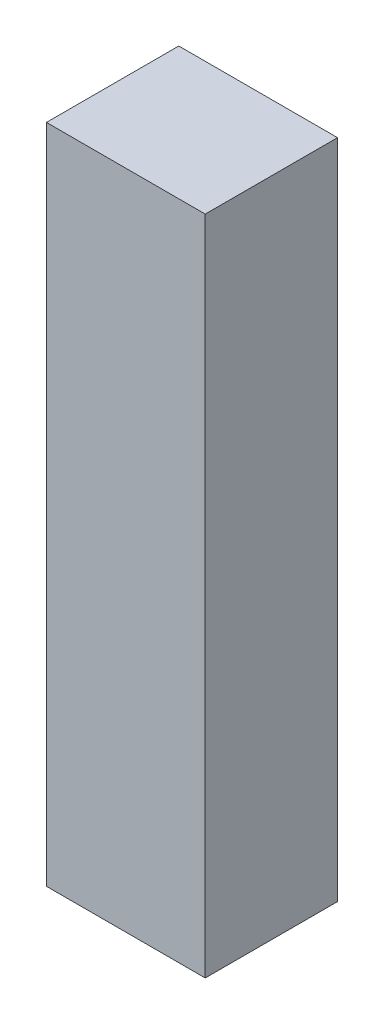
ISO-10303-21;
HEADER;
FILE_DESCRIPTION(('STEP AP214'),'2;1');
FILE_NAME('part.step','',(''),(''),'','','');
FILE_SCHEMA(('AUTOMOTIVE_DESIGN { 1 0 10303 214 1 1 1 1 }'));
ENDSEC;
DATA;
#1=APPLICATION_CONTEXT('core data for automotive mechanical design processes');
#2=APPLICATION_PROTOCOL_DEFINITION('international standard','automotive_design',2000,#1);
#3=PRODUCT_CONTEXT('',#1,'mechanical');
#4=PRODUCT('Part','Part','',(#3));
#5=PRODUCT_RELATED_PRODUCT_CATEGORY('part','',(#4));
#6=PRODUCT_DEFINITION_FORMATION('','',#4);
#7=PRODUCT_DEFINITION_CONTEXT('part definition',#1,'design');
#8=PRODUCT_DEFINITION('design','',#6,#7);
#9=PRODUCT_DEFINITION_SHAPE('','',#8);
#10=(LENGTH_UNIT() NAMED_UNIT(*) SI_UNIT(.MILLI.,.METRE.));
#11=(NAMED_UNIT(*) PLANE_ANGLE_UNIT() SI_UNIT($,.RADIAN.));
#12=(NAMED_UNIT(*) SI_UNIT($,.STERADIAN.) SOLID_ANGLE_UNIT());
#13=UNCERTAINTY_MEASURE_WITH_UNIT(LENGTH_MEASURE(1.E-05),#10,'distance_accuracy_value','');
#14=(GEOMETRIC_REPRESENTATION_CONTEXT(3) GLOBAL_UNCERTAINTY_ASSIGNED_CONTEXT((#13)) GLOBAL_UNIT_ASSIGNED_CONTEXT((#10,
#11,#12)) REPRESENTATION_CONTEXT('',''));
#15=CARTESIAN_POINT('',(0.,0.,0.));
#16=DIRECTION('',(0.,0.,1.));
#17=DIRECTION('',(1.,0.,0.));
#18=AXIS2_PLACEMENT_3D('',#15,#16,#17);
#19=CARTESIAN_POINT('',(12.,50.,20.));
#20=DIRECTION('',(-1.,0.,0.));
#21=DIRECTION('',(0.,0.,1.));
#22=AXIS2_PLACEMENT_3D('',#19,#20,#21);
#23=PLANE('',#22);
#24=DIRECTION('',(0.,1.,0.));
#25=VECTOR('',#24,1.);
#26=CARTESIAN_POINT('',(12.,50.,0.));
#27=LINE('',#26,#25);
#28=CARTESIAN_POINT('',(12.,-50.,0.));
#29=VERTEX_POINT('',#28);
#30=CARTESIAN_POINT('',(12.,50.,0.));
#31=VERTEX_POINT('',#30);
#32=EDGE_CURVE('E97',#29,#31,#27,.T.);
#33=ORIENTED_EDGE('',*,*,#32,.T.);
#34=DIRECTION('',(0.,0.,-1.));
#35=VECTOR('',#34,1.);
#36=CARTESIAN_POINT('',(12.,50.,20.));
#37=LINE('',#36,#35);
#38=CARTESIAN_POINT('',(12.,50.,20.));
#39=VERTEX_POINT('',#38);
#40=EDGE_CURVE('E11',#39,#31,#37,.T.);
#41=ORIENTED_EDGE('',*,*,#40,.F.);
#42=DIRECTION('',(0.,1.,0.));
#43=VECTOR('',#42,1.);
#44=CARTESIAN_POINT('',(12.,50.,20.));
#45=LINE('',#44,#43);
#46=CARTESIAN_POINT('',(12.,-50.,20.));
#47=VERTEX_POINT('',#46);
#48=EDGE_CURVE('E85',#47,#39,#45,.T.);
#49=ORIENTED_EDGE('',*,*,#48,.F.);
#50=DIRECTION('',(0.,0.,-1.));
#51=VECTOR('',#50,1.);
#52=CARTESIAN_POINT('',(12.,-50.,20.));
#53=LINE('',#52,#51);
#54=EDGE_CURVE('E93',#47,#29,#53,.T.);
#55=ORIENTED_EDGE('',*,*,#54,.T.);
#56=EDGE_LOOP('',(#33,#41,#49,#55));
#57=FACE_BOUND('',#56,.T.);
#58=ADVANCED_FACE('F34',(#57),#23,.F.);
#59=CARTESIAN_POINT('',(-12.,50.,20.));
#60=DIRECTION('',(0.,-1.,0.));
#61=DIRECTION('',(0.,0.,-1.));
#62=AXIS2_PLACEMENT_3D('',#59,#60,#61);
#63=PLANE('',#62);
#64=DIRECTION('',(-1.,0.,0.));
#65=VECTOR('',#64,1.);
#66=CARTESIAN_POINT('',(-12.,50.,0.));
#67=LINE('',#66,#65);
#68=CARTESIAN_POINT('',(-12.,50.,0.));
#69=VERTEX_POINT('',#68);
#70=EDGE_CURVE('E89',#31,#69,#67,.T.);
#71=ORIENTED_EDGE('',*,*,#70,.T.);
#72=DIRECTION('',(0.,0.,-1.));
#73=VECTOR('',#72,1.);
#74=CARTESIAN_POINT('',(-12.,50.,20.));
#75=LINE('',#74,#73);
#76=CARTESIAN_POINT('',(-12.,50.,20.));
#77=VERTEX_POINT('',#76);
#78=EDGE_CURVE('E42',#77,#69,#75,.T.);
#79=ORIENTED_EDGE('',*,*,#78,.F.);
#80=DIRECTION('',(-1.,0.,0.));
#81=VECTOR('',#80,1.);
#82=CARTESIAN_POINT('',(-12.,50.,20.));
#83=LINE('',#82,#81);
#84=EDGE_CURVE('E80',#39,#77,#83,.T.);
#85=ORIENTED_EDGE('',*,*,#84,.F.);
#86=ORIENTED_EDGE('',*,*,#40,.T.);
#87=EDGE_LOOP('',(#71,#79,#85,#86));
#88=FACE_BOUND('',#87,.T.);
#89=ADVANCED_FACE('F88',(#88),#63,.F.);
#90=CARTESIAN_POINT('',(-12.,50.,20.));
#91=DIRECTION('',(1.,0.,0.));
#92=DIRECTION('',(0.,0.,-1.));
#93=AXIS2_PLACEMENT_3D('',#90,#91,#92);
#94=PLANE('',#93);
#95=DIRECTION('',(0.,-1.,0.));
#96=VECTOR('',#95,1.);
#97=CARTESIAN_POINT('',(-12.,50.,0.));
#98=LINE('',#97,#96);
#99=CARTESIAN_POINT('',(-12.,-50.,0.));
#100=VERTEX_POINT('',#99);
#101=EDGE_CURVE('E67',#69,#100,#98,.T.);
#102=ORIENTED_EDGE('',*,*,#101,.T.);
#103=DIRECTION('',(0.,0.,-1.));
#104=VECTOR('',#103,1.);
#105=CARTESIAN_POINT('',(-12.,-50.,20.));
#106=LINE('',#105,#104);
#107=CARTESIAN_POINT('',(-12.,-50.,20.));
#108=VERTEX_POINT('',#107);
#109=EDGE_CURVE('E90',#108,#100,#106,.T.);
#110=ORIENTED_EDGE('',*,*,#109,.F.);
#111=DIRECTION('',(0.,-1.,0.));
#112=VECTOR('',#111,1.);
#113=CARTESIAN_POINT('',(-12.,50.,20.));
#114=LINE('',#113,#112);
#115=EDGE_CURVE('E83',#77,#108,#114,.T.);
#116=ORIENTED_EDGE('',*,*,#115,.F.);
#117=ORIENTED_EDGE('',*,*,#78,.T.);
#118=EDGE_LOOP('',(#102,#110,#116,#117));
#119=FACE_BOUND('',#118,.T.);
#120=ADVANCED_FACE('F91',(#119),#94,.F.);
#121=CARTESIAN_POINT('',(-12.,-50.,20.));
#122=DIRECTION('',(0.,1.,0.));
#123=DIRECTION('',(0.,0.,1.));
#124=AXIS2_PLACEMENT_3D('',#121,#122,#123);
#125=PLANE('',#124);
#126=DIRECTION('',(1.,0.,0.));
#127=VECTOR('',#126,1.);
#128=CARTESIAN_POINT('',(-12.,-50.,0.));
#129=LINE('',#128,#127);
#130=EDGE_CURVE('E73',#100,#29,#129,.T.);
#131=ORIENTED_EDGE('',*,*,#130,.T.);
#132=ORIENTED_EDGE('',*,*,#54,.F.);
#133=DIRECTION('',(1.,0.,0.));
#134=VECTOR('',#133,1.);
#135=CARTESIAN_POINT('',(-12.,-50.,20.));
#136=LINE('',#135,#134);
#137=EDGE_CURVE('E50',#108,#47,#136,.T.);
#138=ORIENTED_EDGE('',*,*,#137,.F.);
#139=ORIENTED_EDGE('',*,*,#109,.T.);
#140=EDGE_LOOP('',(#131,#132,#138,#139));
#141=FACE_BOUND('',#140,.T.);
#142=ADVANCED_FACE('F104',(#141),#125,.F.);
#143=CARTESIAN_POINT('',(0.,0.,20.));
#144=DIRECTION('',(0.,0.,1.));
#145=DIRECTION('',(1.,0.,0.));
#146=AXIS2_PLACEMENT_3D('',#143,#144,#145);
#147=PLANE('',#146);
#148=ORIENTED_EDGE('',*,*,#48,.T.);
#149=ORIENTED_EDGE('',*,*,#84,.T.);
#150=ORIENTED_EDGE('',*,*,#115,.T.);
#151=ORIENTED_EDGE('',*,*,#137,.T.);
#152=EDGE_LOOP('',(#148,#149,#150,#151));
#153=FACE_BOUND('',#152,.T.);
#154=ADVANCED_FACE('F81',(#153),#147,.T.);
#155=CARTESIAN_POINT('',(0.,0.,0.));
#156=DIRECTION('',(0.,0.,1.));
#157=DIRECTION('',(1.,0.,0.));
#158=AXIS2_PLACEMENT_3D('',#155,#156,#157);
#159=PLANE('',#158);
#160=ORIENTED_EDGE('',*,*,#32,.F.);
#161=ORIENTED_EDGE('',*,*,#130,.F.);
#162=ORIENTED_EDGE('',*,*,#101,.F.);
#163=ORIENTED_EDGE('',*,*,#70,.F.);
#164=EDGE_LOOP('',(#160,#161,#162,#163));
#165=FACE_BOUND('',#164,.T.);
#166=ADVANCED_FACE('F107',(#165),#159,.F.);
#167=CLOSED_SHELL('',(#58,#89,#120,#142,#154,#166));
#168=MANIFOLD_SOLID_BREP('B2',#167);
#169=ADVANCED_BREP_SHAPE_REPRESENTATION('',(#18,#168),#14);
#170=SHAPE_DEFINITION_REPRESENTATION(#9,#169);
ENDSEC;
END-ISO-10303-21;
